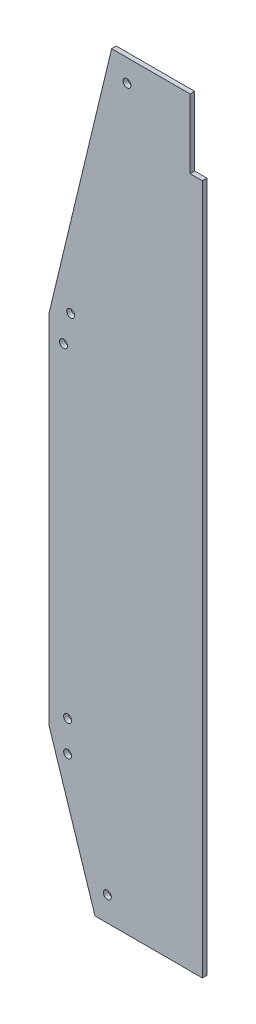
ISO-10303-21;
HEADER;
FILE_DESCRIPTION(('STEP AP214'),'2;1');
FILE_NAME('part.step','',(''),(''),'','','');
FILE_SCHEMA(('AUTOMOTIVE_DESIGN { 1 0 10303 214 1 1 1 1 }'));
ENDSEC;
DATA;
#1=APPLICATION_CONTEXT('core data for automotive mechanical design processes');
#2=APPLICATION_PROTOCOL_DEFINITION('international standard','automotive_design',2000,#1);
#3=PRODUCT_CONTEXT('',#1,'mechanical');
#4=PRODUCT('Part','Part','',(#3));
#5=PRODUCT_RELATED_PRODUCT_CATEGORY('part','',(#4));
#6=PRODUCT_DEFINITION_FORMATION('','',#4);
#7=PRODUCT_DEFINITION_CONTEXT('part definition',#1,'design');
#8=PRODUCT_DEFINITION('design','',#6,#7);
#9=PRODUCT_DEFINITION_SHAPE('','',#8);
#10=(LENGTH_UNIT() NAMED_UNIT(*) SI_UNIT(.MILLI.,.METRE.));
#11=(NAMED_UNIT(*) PLANE_ANGLE_UNIT() SI_UNIT($,.RADIAN.));
#12=(NAMED_UNIT(*) SI_UNIT($,.STERADIAN.) SOLID_ANGLE_UNIT());
#13=UNCERTAINTY_MEASURE_WITH_UNIT(LENGTH_MEASURE(1.E-05),#10,'distance_accuracy_value','');
#14=(GEOMETRIC_REPRESENTATION_CONTEXT(3) GLOBAL_UNCERTAINTY_ASSIGNED_CONTEXT((#13)) GLOBAL_UNIT_ASSIGNED_CONTEXT((#10,
#11,#12)) REPRESENTATION_CONTEXT('',''));
#15=CARTESIAN_POINT('',(0.,0.,0.));
#16=DIRECTION('',(0.,0.,1.));
#17=DIRECTION('',(1.,0.,0.));
#18=AXIS2_PLACEMENT_3D('',#15,#16,#17);
#19=CARTESIAN_POINT('',(0.,0.,3.));
#20=DIRECTION('',(-1.,0.,0.));
#21=DIRECTION('',(0.,-1.,0.));
#22=AXIS2_PLACEMENT_3D('',#19,#20,#21);
#23=PLANE('',#22);
#24=DIRECTION('',(0.,1.,0.));
#25=VECTOR('',#24,1.);
#26=CARTESIAN_POINT('',(0.,0.,0.));
#27=LINE('',#26,#25);
#28=CARTESIAN_POINT('',(0.,0.,0.));
#29=VERTEX_POINT('',#28);
#30=CARTESIAN_POINT('',(0.,450.3,0.));
#31=VERTEX_POINT('',#30);
#32=EDGE_CURVE('E133',#29,#31,#27,.T.);
#33=ORIENTED_EDGE('',*,*,#32,.T.);
#34=DIRECTION('',(0.,0.,-1.));
#35=VECTOR('',#34,1.);
#36=CARTESIAN_POINT('',(0.,450.3,3.));
#37=LINE('',#36,#35);
#38=CARTESIAN_POINT('',(0.,450.3,3.));
#39=VERTEX_POINT('',#38);
#40=EDGE_CURVE('E11',#39,#31,#37,.T.);
#41=ORIENTED_EDGE('',*,*,#40,.F.);
#42=DIRECTION('',(0.,1.,0.));
#43=VECTOR('',#42,1.);
#44=CARTESIAN_POINT('',(0.,0.,3.));
#45=LINE('',#44,#43);
#46=CARTESIAN_POINT('',(0.,0.,3.));
#47=VERTEX_POINT('',#46);
#48=EDGE_CURVE('E148',#47,#39,#45,.T.);
#49=ORIENTED_EDGE('',*,*,#48,.F.);
#50=DIRECTION('',(0.,0.,-1.));
#51=VECTOR('',#50,1.);
#52=CARTESIAN_POINT('',(0.,0.,3.));
#53=LINE('',#52,#51);
#54=EDGE_CURVE('E129',#47,#29,#53,.T.);
#55=ORIENTED_EDGE('',*,*,#54,.T.);
#56=EDGE_LOOP('',(#33,#41,#49,#55));
#57=FACE_BOUND('',#56,.T.);
#58=ADVANCED_FACE('F37',(#57),#23,.F.);
#59=CARTESIAN_POINT('',(0.,450.3,3.));
#60=DIRECTION('',(0.,-1.,0.));
#61=DIRECTION('',(1.,0.,0.));
#62=AXIS2_PLACEMENT_3D('',#59,#60,#61);
#63=PLANE('',#62);
#64=DIRECTION('',(-1.,0.,0.));
#65=VECTOR('',#64,1.);
#66=CARTESIAN_POINT('',(0.,450.3,0.));
#67=LINE('',#66,#65);
#68=CARTESIAN_POINT('',(-8.,450.3,0.));
#69=VERTEX_POINT('',#68);
#70=EDGE_CURVE('E136',#31,#69,#67,.T.);
#71=ORIENTED_EDGE('',*,*,#70,.T.);
#72=DIRECTION('',(0.,0.,-1.));
#73=VECTOR('',#72,1.);
#74=CARTESIAN_POINT('',(-8.,450.3,3.));
#75=LINE('',#74,#73);
#76=CARTESIAN_POINT('',(-8.,450.3,3.));
#77=VERTEX_POINT('',#76);
#78=EDGE_CURVE('E45',#77,#69,#75,.T.);
#79=ORIENTED_EDGE('',*,*,#78,.F.);
#80=DIRECTION('',(-1.,0.,0.));
#81=VECTOR('',#80,1.);
#82=CARTESIAN_POINT('',(0.,450.3,3.));
#83=LINE('',#82,#81);
#84=EDGE_CURVE('E96',#39,#77,#83,.T.);
#85=ORIENTED_EDGE('',*,*,#84,.F.);
#86=ORIENTED_EDGE('',*,*,#40,.T.);
#87=EDGE_LOOP('',(#71,#79,#85,#86));
#88=FACE_BOUND('',#87,.T.);
#89=ADVANCED_FACE('F245',(#88),#63,.F.);
#90=CARTESIAN_POINT('',(-8.,450.3,3.));
#91=DIRECTION('',(-1.,0.,0.));
#92=DIRECTION('',(0.,0.,1.));
#93=AXIS2_PLACEMENT_3D('',#90,#91,#92);
#94=PLANE('',#93);
#95=DIRECTION('',(0.,1.,0.));
#96=VECTOR('',#95,1.);
#97=CARTESIAN_POINT('',(-8.,450.3,0.));
#98=LINE('',#97,#96);
#99=CARTESIAN_POINT('',(-8.,495.3,0.));
#100=VERTEX_POINT('',#99);
#101=EDGE_CURVE('E139',#69,#100,#98,.T.);
#102=ORIENTED_EDGE('',*,*,#101,.T.);
#103=DIRECTION('',(0.,0.,-1.));
#104=VECTOR('',#103,1.);
#105=CARTESIAN_POINT('',(-8.,495.3,3.));
#106=LINE('',#105,#104);
#107=CARTESIAN_POINT('',(-8.,495.3,3.));
#108=VERTEX_POINT('',#107);
#109=EDGE_CURVE('E155',#108,#100,#106,.T.);
#110=ORIENTED_EDGE('',*,*,#109,.F.);
#111=DIRECTION('',(0.,1.,0.));
#112=VECTOR('',#111,1.);
#113=CARTESIAN_POINT('',(-8.,450.3,3.));
#114=LINE('',#113,#112);
#115=EDGE_CURVE('E163',#77,#108,#114,.T.);
#116=ORIENTED_EDGE('',*,*,#115,.F.);
#117=ORIENTED_EDGE('',*,*,#78,.T.);
#118=EDGE_LOOP('',(#102,#110,#116,#117));
#119=FACE_BOUND('',#118,.T.);
#120=ADVANCED_FACE('F161',(#119),#94,.F.);
#121=CARTESIAN_POINT('',(-8.,495.3,3.));
#122=DIRECTION('',(0.,-1.,0.));
#123=DIRECTION('',(0.,0.,-1.));
#124=AXIS2_PLACEMENT_3D('',#121,#122,#123);
#125=PLANE('',#124);
#126=DIRECTION('',(-1.,0.,0.));
#127=VECTOR('',#126,1.);
#128=CARTESIAN_POINT('',(-8.,495.3,0.));
#129=LINE('',#128,#127);
#130=CARTESIAN_POINT('',(-59.18,495.3,0.));
#131=VERTEX_POINT('',#130);
#132=EDGE_CURVE('E141',#100,#131,#129,.T.);
#133=ORIENTED_EDGE('',*,*,#132,.T.);
#134=DIRECTION('',(0.,0.,-1.));
#135=VECTOR('',#134,1.);
#136=CARTESIAN_POINT('',(-59.18,495.3,3.));
#137=LINE('',#136,#135);
#138=CARTESIAN_POINT('',(-59.18,495.3,3.));
#139=VERTEX_POINT('',#138);
#140=EDGE_CURVE('E152',#139,#131,#137,.T.);
#141=ORIENTED_EDGE('',*,*,#140,.F.);
#142=DIRECTION('',(-1.,0.,0.));
#143=VECTOR('',#142,1.);
#144=CARTESIAN_POINT('',(-8.,495.3,3.));
#145=LINE('',#144,#143);
#146=EDGE_CURVE('E175',#108,#139,#145,.T.);
#147=ORIENTED_EDGE('',*,*,#146,.F.);
#148=ORIENTED_EDGE('',*,*,#109,.T.);
#149=EDGE_LOOP('',(#133,#141,#147,#148));
#150=FACE_BOUND('',#149,.T.);
#151=ADVANCED_FACE('F171',(#150),#125,.F.);
#152=CARTESIAN_POINT('',(-59.18,495.3,3.));
#153=DIRECTION('',(0.972298871243199,-0.233741106738206,0.));
#154=DIRECTION('',(0.233741106738206,0.972298871243199,0.));
#155=AXIS2_PLACEMENT_3D('',#152,#153,#154);
#156=PLANE('',#155);
#157=DIRECTION('',(-0.233741106738206,-0.972298871243199,0.));
#158=VECTOR('',#157,1.);
#159=CARTESIAN_POINT('',(-59.18,495.3,0.));
#160=LINE('',#159,#158);
#161=CARTESIAN_POINT('',(-100.,325.5,0.));
#162=VERTEX_POINT('',#161);
#163=EDGE_CURVE('E143',#131,#162,#160,.T.);
#164=ORIENTED_EDGE('',*,*,#163,.T.);
#165=DIRECTION('',(0.,0.,-1.));
#166=VECTOR('',#165,1.);
#167=CARTESIAN_POINT('',(-100.,325.5,3.));
#168=LINE('',#167,#166);
#169=CARTESIAN_POINT('',(-100.,325.5,3.));
#170=VERTEX_POINT('',#169);
#171=EDGE_CURVE('E124',#170,#162,#168,.T.);
#172=ORIENTED_EDGE('',*,*,#171,.F.);
#173=DIRECTION('',(-0.233741106738206,-0.972298871243199,0.));
#174=VECTOR('',#173,1.);
#175=CARTESIAN_POINT('',(-59.18,495.3,3.));
#176=LINE('',#175,#174);
#177=EDGE_CURVE('E115',#139,#170,#176,.T.);
#178=ORIENTED_EDGE('',*,*,#177,.F.);
#179=ORIENTED_EDGE('',*,*,#140,.T.);
#180=EDGE_LOOP('',(#164,#172,#178,#179));
#181=FACE_BOUND('',#180,.T.);
#182=ADVANCED_FACE('F174',(#181),#156,.F.);
#183=CARTESIAN_POINT('',(-100.,92.65,3.));
#184=DIRECTION('',(1.,0.,0.));
#185=DIRECTION('',(0.,0.,-1.));
#186=AXIS2_PLACEMENT_3D('',#183,#184,#185);
#187=PLANE('',#186);
#188=DIRECTION('',(0.,-1.,0.));
#189=VECTOR('',#188,1.);
#190=CARTESIAN_POINT('',(-100.,92.65,0.));
#191=LINE('',#190,#189);
#192=CARTESIAN_POINT('',(-100.,92.65,0.));
#193=VERTEX_POINT('',#192);
#194=EDGE_CURVE('E123',#162,#193,#191,.T.);
#195=ORIENTED_EDGE('',*,*,#194,.T.);
#196=DIRECTION('',(0.,0.,-1.));
#197=VECTOR('',#196,1.);
#198=CARTESIAN_POINT('',(-100.,92.65,3.));
#199=LINE('',#198,#197);
#200=CARTESIAN_POINT('',(-100.,92.65,3.));
#201=VERTEX_POINT('',#200);
#202=EDGE_CURVE('E120',#201,#193,#199,.T.);
#203=ORIENTED_EDGE('',*,*,#202,.F.);
#204=DIRECTION('',(0.,-1.,0.));
#205=VECTOR('',#204,1.);
#206=CARTESIAN_POINT('',(-100.,92.65,3.));
#207=LINE('',#206,#205);
#208=EDGE_CURVE('E109',#170,#201,#207,.T.);
#209=ORIENTED_EDGE('',*,*,#208,.F.);
#210=ORIENTED_EDGE('',*,*,#171,.T.);
#211=EDGE_LOOP('',(#195,#203,#209,#210));
#212=FACE_BOUND('',#211,.T.);
#213=ADVANCED_FACE('F121',(#212),#187,.F.);
#214=CARTESIAN_POINT('',(-70.,0.,3.));
#215=DIRECTION('',(0.951369306348151,0.308052662605985,0.));
#216=DIRECTION('',(-0.308052662605985,0.951369306348152,0.));
#217=AXIS2_PLACEMENT_3D('',#214,#215,#216);
#218=PLANE('',#217);
#219=DIRECTION('',(0.308052662605985,-0.951369306348152,0.));
#220=VECTOR('',#219,1.);
#221=CARTESIAN_POINT('',(-70.,0.,0.));
#222=LINE('',#221,#220);
#223=CARTESIAN_POINT('',(-70.,0.,0.));
#224=VERTEX_POINT('',#223);
#225=EDGE_CURVE('E82',#193,#224,#222,.T.);
#226=ORIENTED_EDGE('',*,*,#225,.T.);
#227=DIRECTION('',(0.,0.,-1.));
#228=VECTOR('',#227,1.);
#229=CARTESIAN_POINT('',(-70.,0.,3.));
#230=LINE('',#229,#228);
#231=CARTESIAN_POINT('',(-70.,0.,3.));
#232=VERTEX_POINT('',#231);
#233=EDGE_CURVE('E125',#232,#224,#230,.T.);
#234=ORIENTED_EDGE('',*,*,#233,.F.);
#235=DIRECTION('',(0.308052662605985,-0.951369306348152,0.));
#236=VECTOR('',#235,1.);
#237=CARTESIAN_POINT('',(-70.,0.,3.));
#238=LINE('',#237,#236);
#239=EDGE_CURVE('E113',#201,#232,#238,.T.);
#240=ORIENTED_EDGE('',*,*,#239,.F.);
#241=ORIENTED_EDGE('',*,*,#202,.T.);
#242=EDGE_LOOP('',(#226,#234,#240,#241));
#243=FACE_BOUND('',#242,.T.);
#244=ADVANCED_FACE('F127',(#243),#218,.F.);
#245=CARTESIAN_POINT('',(0.,0.,3.));
#246=DIRECTION('',(0.,1.,0.));
#247=DIRECTION('',(-1.,0.,0.));
#248=AXIS2_PLACEMENT_3D('',#245,#246,#247);
#249=PLANE('',#248);
#250=DIRECTION('',(1.,0.,0.));
#251=VECTOR('',#250,1.);
#252=CARTESIAN_POINT('',(0.,0.,0.));
#253=LINE('',#252,#251);
#254=EDGE_CURVE('E88',#224,#29,#253,.T.);
#255=ORIENTED_EDGE('',*,*,#254,.T.);
#256=ORIENTED_EDGE('',*,*,#54,.F.);
#257=DIRECTION('',(1.,0.,0.));
#258=VECTOR('',#257,1.);
#259=CARTESIAN_POINT('',(0.,0.,3.));
#260=LINE('',#259,#258);
#261=EDGE_CURVE('E53',#232,#47,#260,.T.);
#262=ORIENTED_EDGE('',*,*,#261,.F.);
#263=ORIENTED_EDGE('',*,*,#233,.T.);
#264=EDGE_LOOP('',(#255,#256,#262,#263));
#265=FACE_BOUND('',#264,.T.);
#266=ADVANCED_FACE('F252',(#265),#249,.F.);
#267=CARTESIAN_POINT('',(0.,0.,3.));
#268=DIRECTION('',(0.,0.,1.));
#269=DIRECTION('',(1.,0.,0.));
#270=AXIS2_PLACEMENT_3D('',#267,#268,#269);
#271=PLANE('',#270);
#272=CARTESIAN_POINT('',(-61.969716148845,16.,3.));
#273=DIRECTION('',(0.,0.,1.));
#274=DIRECTION('',(1.,0.,0.));
#275=AXIS2_PLACEMENT_3D('',#272,#273,#274);
#276=CIRCLE('',#275,2.6);
#277=CARTESIAN_POINT('',(-59.369716148845,16.,3.));
#278=VERTEX_POINT('',#277);
#279=EDGE_CURVE('E137',#278,#278,#276,.T.);
#280=ORIENTED_EDGE('',*,*,#279,.F.);
#281=EDGE_LOOP('',(#280));
#282=FACE_BOUND('',#281,.T.);
#283=CARTESIAN_POINT('',(-87.8656030259848,82.65,3.));
#284=DIRECTION('',(0.,0.,1.));
#285=DIRECTION('',(1.,0.,0.));
#286=AXIS2_PLACEMENT_3D('',#283,#284,#285);
#287=CIRCLE('',#286,2.6);
#288=CARTESIAN_POINT('',(-85.2656030259848,82.65,3.));
#289=VERTEX_POINT('',#288);
#290=EDGE_CURVE('E183',#289,#289,#287,.T.);
#291=ORIENTED_EDGE('',*,*,#290,.F.);
#292=EDGE_LOOP('',(#291));
#293=FACE_BOUND('',#292,.T.);
#294=CARTESIAN_POINT('',(-87.8656030259848,102.65,3.));
#295=DIRECTION('',(0.,0.,1.));
#296=DIRECTION('',(1.,0.,0.));
#297=AXIS2_PLACEMENT_3D('',#294,#295,#296);
#298=CIRCLE('',#297,2.6);
#299=CARTESIAN_POINT('',(-85.2656030259848,102.65,3.));
#300=VERTEX_POINT('',#299);
#301=EDGE_CURVE('E186',#300,#300,#298,.T.);
#302=ORIENTED_EDGE('',*,*,#301,.F.);
#303=EDGE_LOOP('',(#302));
#304=FACE_BOUND('',#303,.T.);
#305=CARTESIAN_POINT('',(-85.8606055036844,332.418095431573,3.));
#306=DIRECTION('',(0.,0.,1.));
#307=DIRECTION('',(1.,0.,0.));
#308=AXIS2_PLACEMENT_3D('',#305,#306,#307);
#309=CIRCLE('',#308,2.6);
#310=CARTESIAN_POINT('',(-83.2606055036844,332.418095431573,3.));
#311=VERTEX_POINT('',#310);
#312=EDGE_CURVE('E189',#311,#311,#309,.T.);
#313=ORIENTED_EDGE('',*,*,#312,.F.);
#314=EDGE_LOOP('',(#313));
#315=FACE_BOUND('',#314,.T.);
#316=CARTESIAN_POINT('',(-90.5354276384485,312.972118006709,3.));
#317=DIRECTION('',(0.,0.,1.));
#318=DIRECTION('',(1.,0.,0.));
#319=AXIS2_PLACEMENT_3D('',#316,#317,#318);
#320=CIRCLE('',#319,2.60000000000001);
#321=CARTESIAN_POINT('',(-87.9354276384485,312.972118006709,3.));
#322=VERTEX_POINT('',#321);
#323=EDGE_CURVE('E192',#322,#322,#320,.T.);
#324=ORIENTED_EDGE('',*,*,#323,.F.);
#325=EDGE_LOOP('',(#324));
#326=FACE_BOUND('',#325,.T.);
#327=CARTESIAN_POINT('',(-49.1687399106098,480.767951320596,3.));
#328=DIRECTION('',(0.,0.,1.));
#329=DIRECTION('',(1.,0.,0.));
#330=AXIS2_PLACEMENT_3D('',#327,#328,#329);
#331=CIRCLE('',#330,2.60000000000002);
#332=CARTESIAN_POINT('',(-46.5687399106098,480.767951320596,3.));
#333=VERTEX_POINT('',#332);
#334=EDGE_CURVE('E195',#333,#333,#331,.T.);
#335=ORIENTED_EDGE('',*,*,#334,.F.);
#336=EDGE_LOOP('',(#335));
#337=FACE_BOUND('',#336,.T.);
#338=ORIENTED_EDGE('',*,*,#48,.T.);
#339=ORIENTED_EDGE('',*,*,#84,.T.);
#340=ORIENTED_EDGE('',*,*,#115,.T.);
#341=ORIENTED_EDGE('',*,*,#146,.T.);
#342=ORIENTED_EDGE('',*,*,#177,.T.);
#343=ORIENTED_EDGE('',*,*,#208,.T.);
#344=ORIENTED_EDGE('',*,*,#239,.T.);
#345=ORIENTED_EDGE('',*,*,#261,.T.);
#346=EDGE_LOOP('',(#338,#339,#340,#341,#342,#343,#344,#345));
#347=FACE_BOUND('',#346,.T.);
#348=ADVANCED_FACE('F111',(#282,#293,#304,#315,#326,#337,#347),#271,.T.);
#349=CARTESIAN_POINT('',(0.,0.,0.));
#350=DIRECTION('',(0.,0.,1.));
#351=DIRECTION('',(1.,0.,0.));
#352=AXIS2_PLACEMENT_3D('',#349,#350,#351);
#353=PLANE('',#352);
#354=CARTESIAN_POINT('',(-61.969716148845,16.,0.));
#355=DIRECTION('',(0.,0.,-1.));
#356=DIRECTION('',(-1.,0.,0.));
#357=AXIS2_PLACEMENT_3D('',#354,#355,#356);
#358=CIRCLE('',#357,2.6);
#359=CARTESIAN_POINT('',(-64.569716148845,16.,0.));
#360=VERTEX_POINT('',#359);
#361=EDGE_CURVE('E198',#360,#360,#358,.T.);
#362=ORIENTED_EDGE('',*,*,#361,.F.);
#363=EDGE_LOOP('',(#362));
#364=FACE_BOUND('',#363,.T.);
#365=CARTESIAN_POINT('',(-87.8656030259848,82.65,0.));
#366=DIRECTION('',(0.,0.,-1.));
#367=DIRECTION('',(-1.,0.,0.));
#368=AXIS2_PLACEMENT_3D('',#365,#366,#367);
#369=CIRCLE('',#368,2.6);
#370=CARTESIAN_POINT('',(-90.4656030259848,82.65,0.));
#371=VERTEX_POINT('',#370);
#372=EDGE_CURVE('E211',#371,#371,#369,.T.);
#373=ORIENTED_EDGE('',*,*,#372,.F.);
#374=EDGE_LOOP('',(#373));
#375=FACE_BOUND('',#374,.T.);
#376=CARTESIAN_POINT('',(-87.8656030259848,102.65,0.));
#377=DIRECTION('',(0.,0.,-1.));
#378=DIRECTION('',(-1.,0.,0.));
#379=AXIS2_PLACEMENT_3D('',#376,#377,#378);
#380=CIRCLE('',#379,2.6);
#381=CARTESIAN_POINT('',(-90.4656030259848,102.65,0.));
#382=VERTEX_POINT('',#381);
#383=EDGE_CURVE('E208',#382,#382,#380,.T.);
#384=ORIENTED_EDGE('',*,*,#383,.F.);
#385=EDGE_LOOP('',(#384));
#386=FACE_BOUND('',#385,.T.);
#387=CARTESIAN_POINT('',(-85.8606055036844,332.418095431573,0.));
#388=DIRECTION('',(0.,0.,-1.));
#389=DIRECTION('',(-1.,0.,0.));
#390=AXIS2_PLACEMENT_3D('',#387,#388,#389);
#391=CIRCLE('',#390,2.6);
#392=CARTESIAN_POINT('',(-88.4606055036844,332.418095431573,0.));
#393=VERTEX_POINT('',#392);
#394=EDGE_CURVE('E205',#393,#393,#391,.T.);
#395=ORIENTED_EDGE('',*,*,#394,.F.);
#396=EDGE_LOOP('',(#395));
#397=FACE_BOUND('',#396,.T.);
#398=CARTESIAN_POINT('',(-90.5354276384485,312.972118006709,0.));
#399=DIRECTION('',(0.,0.,-1.));
#400=DIRECTION('',(-1.,0.,0.));
#401=AXIS2_PLACEMENT_3D('',#398,#399,#400);
#402=CIRCLE('',#401,2.60000000000001);
#403=CARTESIAN_POINT('',(-93.1354276384485,312.972118006709,0.));
#404=VERTEX_POINT('',#403);
#405=EDGE_CURVE('E202',#404,#404,#402,.T.);
#406=ORIENTED_EDGE('',*,*,#405,.F.);
#407=EDGE_LOOP('',(#406));
#408=FACE_BOUND('',#407,.T.);
#409=CARTESIAN_POINT('',(-49.1687399106098,480.767951320596,0.));
#410=DIRECTION('',(0.,0.,-1.));
#411=DIRECTION('',(-1.,0.,0.));
#412=AXIS2_PLACEMENT_3D('',#409,#410,#411);
#413=CIRCLE('',#412,2.60000000000002);
#414=CARTESIAN_POINT('',(-51.7687399106098,480.767951320596,0.));
#415=VERTEX_POINT('',#414);
#416=EDGE_CURVE('E199',#415,#415,#413,.T.);
#417=ORIENTED_EDGE('',*,*,#416,.F.);
#418=EDGE_LOOP('',(#417));
#419=FACE_BOUND('',#418,.T.);
#420=ORIENTED_EDGE('',*,*,#32,.F.);
#421=ORIENTED_EDGE('',*,*,#254,.F.);
#422=ORIENTED_EDGE('',*,*,#225,.F.);
#423=ORIENTED_EDGE('',*,*,#194,.F.);
#424=ORIENTED_EDGE('',*,*,#163,.F.);
#425=ORIENTED_EDGE('',*,*,#132,.F.);
#426=ORIENTED_EDGE('',*,*,#101,.F.);
#427=ORIENTED_EDGE('',*,*,#70,.F.);
#428=EDGE_LOOP('',(#420,#421,#422,#423,#424,#425,#426,#427));
#429=FACE_BOUND('',#428,.T.);
#430=ADVANCED_FACE('F167',(#364,#375,#386,#397,#408,#419,#429),#353,.F.);
#431=CARTESIAN_POINT('',(-49.1687399106098,480.767951320596,20.));
#432=DIRECTION('',(0.,0.,-1.));
#433=DIRECTION('',(-1.,0.,0.));
#434=AXIS2_PLACEMENT_3D('',#431,#432,#433);
#435=CYLINDRICAL_SURFACE('',#434,2.60000000000002);
#436=ORIENTED_EDGE('',*,*,#334,.T.);
#437=EDGE_LOOP('',(#436));
#438=FACE_BOUND('',#437,.T.);
#439=ORIENTED_EDGE('',*,*,#416,.T.);
#440=EDGE_LOOP('',(#439));
#441=FACE_BOUND('',#440,.T.);
#442=ADVANCED_FACE('F221',(#438,#441),#435,.F.);
#443=CARTESIAN_POINT('',(-90.5354276384485,312.972118006709,20.));
#444=DIRECTION('',(0.,0.,-1.));
#445=DIRECTION('',(-1.,0.,0.));
#446=AXIS2_PLACEMENT_3D('',#443,#444,#445);
#447=CYLINDRICAL_SURFACE('',#446,2.60000000000001);
#448=ORIENTED_EDGE('',*,*,#323,.T.);
#449=EDGE_LOOP('',(#448));
#450=FACE_BOUND('',#449,.T.);
#451=ORIENTED_EDGE('',*,*,#405,.T.);
#452=EDGE_LOOP('',(#451));
#453=FACE_BOUND('',#452,.T.);
#454=ADVANCED_FACE('F234',(#450,#453),#447,.F.);
#455=CARTESIAN_POINT('',(-85.8606055036844,332.418095431573,20.));
#456=DIRECTION('',(0.,0.,-1.));
#457=DIRECTION('',(-1.,0.,0.));
#458=AXIS2_PLACEMENT_3D('',#455,#456,#457);
#459=CYLINDRICAL_SURFACE('',#458,2.6);
#460=ORIENTED_EDGE('',*,*,#312,.T.);
#461=EDGE_LOOP('',(#460));
#462=FACE_BOUND('',#461,.T.);
#463=ORIENTED_EDGE('',*,*,#394,.T.);
#464=EDGE_LOOP('',(#463));
#465=FACE_BOUND('',#464,.T.);
#466=ADVANCED_FACE('F240',(#462,#465),#459,.F.);
#467=CARTESIAN_POINT('',(-87.8656030259848,102.65,20.));
#468=DIRECTION('',(0.,0.,-1.));
#469=DIRECTION('',(-1.,0.,0.));
#470=AXIS2_PLACEMENT_3D('',#467,#468,#469);
#471=CYLINDRICAL_SURFACE('',#470,2.6);
#472=ORIENTED_EDGE('',*,*,#301,.T.);
#473=EDGE_LOOP('',(#472));
#474=FACE_BOUND('',#473,.T.);
#475=ORIENTED_EDGE('',*,*,#383,.T.);
#476=EDGE_LOOP('',(#475));
#477=FACE_BOUND('',#476,.T.);
#478=ADVANCED_FACE('F324',(#474,#477),#471,.F.);
#479=CARTESIAN_POINT('',(-87.8656030259848,82.65,20.));
#480=DIRECTION('',(0.,0.,-1.));
#481=DIRECTION('',(-1.,0.,0.));
#482=AXIS2_PLACEMENT_3D('',#479,#480,#481);
#483=CYLINDRICAL_SURFACE('',#482,2.6);
#484=ORIENTED_EDGE('',*,*,#290,.T.);
#485=EDGE_LOOP('',(#484));
#486=FACE_BOUND('',#485,.T.);
#487=ORIENTED_EDGE('',*,*,#372,.T.);
#488=EDGE_LOOP('',(#487));
#489=FACE_BOUND('',#488,.T.);
#490=ADVANCED_FACE('F334',(#486,#489),#483,.F.);
#491=CARTESIAN_POINT('',(-61.969716148845,16.,20.));
#492=DIRECTION('',(0.,0.,-1.));
#493=DIRECTION('',(-1.,0.,0.));
#494=AXIS2_PLACEMENT_3D('',#491,#492,#493);
#495=CYLINDRICAL_SURFACE('',#494,2.6);
#496=ORIENTED_EDGE('',*,*,#279,.T.);
#497=EDGE_LOOP('',(#496));
#498=FACE_BOUND('',#497,.T.);
#499=ORIENTED_EDGE('',*,*,#361,.T.);
#500=EDGE_LOOP('',(#499));
#501=FACE_BOUND('',#500,.T.);
#502=ADVANCED_FACE('F217',(#498,#501),#495,.F.);
#503=CLOSED_SHELL('',(#58,#89,#120,#151,#182,#213,#244,#266,#348,#430,#442,#454,#466,#478,#490,#502));
#504=MANIFOLD_SOLID_BREP('B2',#503);
#505=ADVANCED_BREP_SHAPE_REPRESENTATION('',(#18,#504),#14);
#506=SHAPE_DEFINITION_REPRESENTATION(#9,#505);
ENDSEC;
END-ISO-10303-21;
